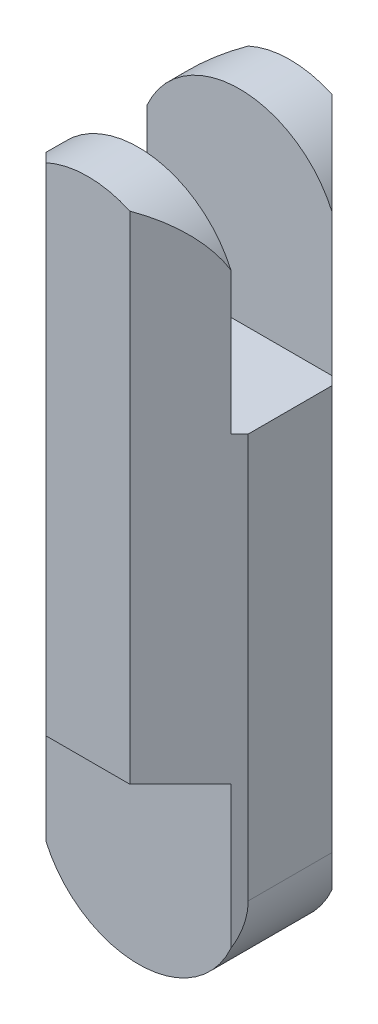
ISO-10303-21;
HEADER;
FILE_DESCRIPTION(('STEP AP214'),'2;1');
FILE_NAME('part.step','',(''),(''),'','','');
FILE_SCHEMA(('AUTOMOTIVE_DESIGN { 1 0 10303 214 1 1 1 1 }'));
ENDSEC;
DATA;
#1=APPLICATION_CONTEXT('core data for automotive mechanical design processes');
#2=APPLICATION_PROTOCOL_DEFINITION('international standard','automotive_design',2000,#1);
#3=PRODUCT_CONTEXT('',#1,'mechanical');
#4=PRODUCT('Part','Part','',(#3));
#5=PRODUCT_RELATED_PRODUCT_CATEGORY('part','',(#4));
#6=PRODUCT_DEFINITION_FORMATION('','',#4);
#7=PRODUCT_DEFINITION_CONTEXT('part definition',#1,'design');
#8=PRODUCT_DEFINITION('design','',#6,#7);
#9=PRODUCT_DEFINITION_SHAPE('','',#8);
#10=(LENGTH_UNIT() NAMED_UNIT(*) SI_UNIT(.MILLI.,.METRE.));
#11=(NAMED_UNIT(*) PLANE_ANGLE_UNIT() SI_UNIT($,.RADIAN.));
#12=(NAMED_UNIT(*) SI_UNIT($,.STERADIAN.) SOLID_ANGLE_UNIT());
#13=UNCERTAINTY_MEASURE_WITH_UNIT(LENGTH_MEASURE(1.E-05),#10,'distance_accuracy_value','');
#14=(GEOMETRIC_REPRESENTATION_CONTEXT(3) GLOBAL_UNCERTAINTY_ASSIGNED_CONTEXT((#13)) GLOBAL_UNIT_ASSIGNED_CONTEXT((#10,
#11,#12)) REPRESENTATION_CONTEXT('',''));
#15=CARTESIAN_POINT('',(0.,0.,0.));
#16=DIRECTION('',(0.,0.,1.));
#17=DIRECTION('',(1.,0.,0.));
#18=AXIS2_PLACEMENT_3D('',#15,#16,#17);
#19=CARTESIAN_POINT('',(4.14213562373094,70.,-10.));
#20=DIRECTION('',(0.,0.,1.));
#21=DIRECTION('',(1.,0.,0.));
#22=AXIS2_PLACEMENT_3D('',#19,#20,#21);
#23=PLANE('',#22);
#24=DIRECTION('',(0.,-1.,0.));
#25=VECTOR('',#24,1.);
#26=CARTESIAN_POINT('',(-4.14213562373096,70.,-10.));
#27=LINE('',#26,#25);
#28=CARTESIAN_POINT('',(-4.14213562373096,69.1017972112445,-10.));
#29=VERTEX_POINT('',#28);
#30=CARTESIAN_POINT('',(-4.14213562373096,20.,-10.));
#31=VERTEX_POINT('',#30);
#32=EDGE_CURVE('E174',#29,#31,#27,.T.);
#33=ORIENTED_EDGE('',*,*,#32,.F.);
#34=CARTESIAN_POINT('',(0.,60.,-10.));
#35=DIRECTION('',(0.,0.,1.));
#36=DIRECTION('',(1.,0.,0.));
#37=AXIS2_PLACEMENT_3D('',#34,#35,#36);
#38=CIRCLE('',#37,10.);
#39=CARTESIAN_POINT('',(4.14213562373094,69.1017972112445,-10.));
#40=VERTEX_POINT('',#39);
#41=EDGE_CURVE('E297',#29,#40,#38,.F.);
#42=ORIENTED_EDGE('',*,*,#41,.T.);
#43=DIRECTION('',(0.,-1.,0.));
#44=VECTOR('',#43,1.);
#45=CARTESIAN_POINT('',(4.14213562373094,70.,-10.));
#46=LINE('',#45,#44);
#47=CARTESIAN_POINT('',(4.14213562373094,20.,-10.));
#48=VERTEX_POINT('',#47);
#49=EDGE_CURVE('E176',#40,#48,#46,.T.);
#50=ORIENTED_EDGE('',*,*,#49,.T.);
#51=DIRECTION('',(1.,0.,0.));
#52=VECTOR('',#51,1.);
#53=CARTESIAN_POINT('',(10.,20.,-10.));
#54=LINE('',#53,#52);
#55=EDGE_CURVE('E232',#31,#48,#54,.T.);
#56=ORIENTED_EDGE('',*,*,#55,.F.);
#57=EDGE_LOOP('',(#33,#42,#50,#56));
#58=FACE_BOUND('',#57,.T.);
#59=ADVANCED_FACE('F34',(#58),#23,.F.);
#60=CARTESIAN_POINT('',(-4.14213562373096,70.,10.));
#61=DIRECTION('',(0.,0.,-1.));
#62=DIRECTION('',(-1.,0.,0.));
#63=AXIS2_PLACEMENT_3D('',#60,#61,#62);
#64=PLANE('',#63);
#65=DIRECTION('',(0.,-1.,0.));
#66=VECTOR('',#65,1.);
#67=CARTESIAN_POINT('',(4.14213562373096,70.,10.));
#68=LINE('',#67,#66);
#69=CARTESIAN_POINT('',(4.14213562373096,69.1017972112445,10.));
#70=VERTEX_POINT('',#69);
#71=CARTESIAN_POINT('',(4.14213562373096,20.,10.));
#72=VERTEX_POINT('',#71);
#73=EDGE_CURVE('E159',#70,#72,#68,.T.);
#74=ORIENTED_EDGE('',*,*,#73,.F.);
#75=CARTESIAN_POINT('',(0.,60.,10.));
#76=DIRECTION('',(0.,0.,-1.));
#77=DIRECTION('',(1.,0.,0.));
#78=AXIS2_PLACEMENT_3D('',#75,#76,#77);
#79=CIRCLE('',#78,10.);
#80=CARTESIAN_POINT('',(-4.14213562373096,69.1017972112445,10.));
#81=VERTEX_POINT('',#80);
#82=EDGE_CURVE('E147',#81,#70,#79,.T.);
#83=ORIENTED_EDGE('',*,*,#82,.F.);
#84=DIRECTION('',(0.,-1.,0.));
#85=VECTOR('',#84,1.);
#86=CARTESIAN_POINT('',(-4.14213562373096,70.,10.));
#87=LINE('',#86,#85);
#88=CARTESIAN_POINT('',(-4.14213562373096,20.,10.));
#89=VERTEX_POINT('',#88);
#90=EDGE_CURVE('E157',#81,#89,#87,.T.);
#91=ORIENTED_EDGE('',*,*,#90,.T.);
#92=DIRECTION('',(-1.,0.,0.));
#93=VECTOR('',#92,1.);
#94=CARTESIAN_POINT('',(-10.,20.,10.));
#95=LINE('',#94,#93);
#96=EDGE_CURVE('E244',#72,#89,#95,.T.);
#97=ORIENTED_EDGE('',*,*,#96,.F.);
#98=EDGE_LOOP('',(#74,#83,#91,#97));
#99=FACE_BOUND('',#98,.T.);
#100=ADVANCED_FACE('F155',(#99),#64,.F.);
#101=CARTESIAN_POINT('',(10.,70.,-4.14213562373095));
#102=DIRECTION('',(-0.707106781186547,0.,0.707106781186548));
#103=DIRECTION('',(0.707106781186548,0.,0.707106781186547));
#104=AXIS2_PLACEMENT_3D('',#101,#102,#103);
#105=PLANE('',#104);
#106=ORIENTED_EDGE('',*,*,#49,.F.);
#107=CARTESIAN_POINT('',(0.,60.,-14.1421356237309));
#108=DIRECTION('',(-0.707106781186547,0.,0.707106781186548));
#109=DIRECTION('',(0.707106781186548,0.,0.707106781186547));
#110=AXIS2_PLACEMENT_3D('',#107,#108,#109);
#111=ELLIPSE('',#110,14.1421356237309,10.);
#112=CARTESIAN_POINT('',(9.14213562373095,64.0523272618718,-5.));
#113=VERTEX_POINT('',#112);
#114=EDGE_CURVE('E293',#40,#113,#111,.F.);
#115=ORIENTED_EDGE('',*,*,#114,.T.);
#116=DIRECTION('',(0.,1.,0.));
#117=VECTOR('',#116,1.);
#118=CARTESIAN_POINT('',(9.14213562373095,70.,-5.));
#119=LINE('',#118,#117);
#120=CARTESIAN_POINT('',(9.14213562373095,50.,-5.));
#121=VERTEX_POINT('',#120);
#122=EDGE_CURVE('E221',#121,#113,#119,.T.);
#123=ORIENTED_EDGE('',*,*,#122,.F.);
#124=DIRECTION('',(0.707106781186548,0.,0.707106781186547));
#125=VECTOR('',#124,1.);
#126=CARTESIAN_POINT('',(10.,50.,-4.14213562373095));
#127=LINE('',#126,#125);
#128=CARTESIAN_POINT('',(10.,50.,-4.14213562373095));
#129=VERTEX_POINT('',#128);
#130=EDGE_CURVE('E230',#121,#129,#127,.T.);
#131=ORIENTED_EDGE('',*,*,#130,.T.);
#132=DIRECTION('',(0.,-1.,0.));
#133=VECTOR('',#132,1.);
#134=CARTESIAN_POINT('',(10.,70.,-4.14213562373095));
#135=LINE('',#134,#133);
#136=CARTESIAN_POINT('',(10.,10.,-4.14213562373095));
#137=VERTEX_POINT('',#136);
#138=EDGE_CURVE('E178',#129,#137,#135,.T.);
#139=ORIENTED_EDGE('',*,*,#138,.T.);
#140=CARTESIAN_POINT('',(0.,10.,-14.1421356237309));
#141=DIRECTION('',(-0.707106781186547,0.,0.707106781186548));
#142=DIRECTION('',(0.707106781186548,0.,0.707106781186547));
#143=AXIS2_PLACEMENT_3D('',#140,#141,#142);
#144=ELLIPSE('',#143,14.1421356237309,10.);
#145=CARTESIAN_POINT('',(9.14213562373095,5.94767273812816,-5.00000000000001));
#146=VERTEX_POINT('',#145);
#147=EDGE_CURVE('E268',#137,#146,#144,.F.);
#148=ORIENTED_EDGE('',*,*,#147,.T.);
#149=DIRECTION('',(0.,-1.,0.));
#150=VECTOR('',#149,1.);
#151=CARTESIAN_POINT('',(9.14213562373095,70.,-5.00000000000001));
#152=LINE('',#151,#150);
#153=CARTESIAN_POINT('',(9.14213562373095,20.,-5.00000000000001));
#154=VERTEX_POINT('',#153);
#155=EDGE_CURVE('E237',#154,#146,#152,.T.);
#156=ORIENTED_EDGE('',*,*,#155,.F.);
#157=DIRECTION('',(-0.707106781186548,0.,-0.707106781186547));
#158=VECTOR('',#157,1.);
#159=CARTESIAN_POINT('',(10.,20.,-4.14213562373095));
#160=LINE('',#159,#158);
#161=EDGE_CURVE('E241',#154,#48,#160,.T.);
#162=ORIENTED_EDGE('',*,*,#161,.T.);
#163=EDGE_LOOP('',(#106,#115,#123,#131,#139,#148,#156,#162));
#164=FACE_BOUND('',#163,.T.);
#165=ADVANCED_FACE('F274',(#164),#105,.F.);
#166=CARTESIAN_POINT('',(-4.14213562373096,70.,-10.));
#167=DIRECTION('',(0.707106781186548,0.,0.707106781186547));
#168=DIRECTION('',(0.707106781186547,0.,-0.707106781186548));
#169=AXIS2_PLACEMENT_3D('',#166,#167,#168);
#170=PLANE('',#169);
#171=DIRECTION('',(0.,-1.,0.));
#172=VECTOR('',#171,1.);
#173=CARTESIAN_POINT('',(-9.14213562373095,70.,-5.));
#174=LINE('',#173,#172);
#175=CARTESIAN_POINT('',(-9.14213562373095,64.0523272618718,-5.));
#176=VERTEX_POINT('',#175);
#177=CARTESIAN_POINT('',(-9.14213562373095,50.,-5.));
#178=VERTEX_POINT('',#177);
#179=EDGE_CURVE('E219',#176,#178,#174,.T.);
#180=ORIENTED_EDGE('',*,*,#179,.F.);
#181=CARTESIAN_POINT('',(0.,60.,-14.142135623731));
#182=DIRECTION('',(0.707106781186548,0.,0.707106781186547));
#183=DIRECTION('',(-0.707106781186547,0.,0.707106781186548));
#184=AXIS2_PLACEMENT_3D('',#181,#182,#183);
#185=ELLIPSE('',#184,14.142135623731,10.);
#186=EDGE_CURVE('E301',#176,#29,#185,.F.);
#187=ORIENTED_EDGE('',*,*,#186,.T.);
#188=ORIENTED_EDGE('',*,*,#32,.T.);
#189=DIRECTION('',(-0.707106781186547,0.,0.707106781186548));
#190=VECTOR('',#189,1.);
#191=CARTESIAN_POINT('',(-4.14213562373096,20.,-10.));
#192=LINE('',#191,#190);
#193=CARTESIAN_POINT('',(-9.14213562373096,20.,-5.));
#194=VERTEX_POINT('',#193);
#195=EDGE_CURVE('E187',#31,#194,#192,.T.);
#196=ORIENTED_EDGE('',*,*,#195,.T.);
#197=DIRECTION('',(0.,1.,0.));
#198=VECTOR('',#197,1.);
#199=CARTESIAN_POINT('',(-9.14213562373096,70.,-5.));
#200=LINE('',#199,#198);
#201=CARTESIAN_POINT('',(-9.14213562373096,5.94767273812821,-5.));
#202=VERTEX_POINT('',#201);
#203=EDGE_CURVE('E185',#202,#194,#200,.T.);
#204=ORIENTED_EDGE('',*,*,#203,.F.);
#205=CARTESIAN_POINT('',(0.,10.,-14.142135623731));
#206=DIRECTION('',(0.707106781186548,0.,0.707106781186547));
#207=DIRECTION('',(-0.707106781186547,0.,0.707106781186548));
#208=AXIS2_PLACEMENT_3D('',#205,#206,#207);
#209=ELLIPSE('',#208,14.142135623731,10.);
#210=CARTESIAN_POINT('',(-10.,10.,-4.14213562373095));
#211=VERTEX_POINT('',#210);
#212=EDGE_CURVE('E258',#202,#211,#209,.F.);
#213=ORIENTED_EDGE('',*,*,#212,.T.);
#214=DIRECTION('',(0.,-1.,0.));
#215=VECTOR('',#214,1.);
#216=CARTESIAN_POINT('',(-10.,70.,-4.14213562373095));
#217=LINE('',#216,#215);
#218=CARTESIAN_POINT('',(-10.,50.,-4.14213562373096));
#219=VERTEX_POINT('',#218);
#220=EDGE_CURVE('E167',#219,#211,#217,.T.);
#221=ORIENTED_EDGE('',*,*,#220,.F.);
#222=DIRECTION('',(0.707106781186547,0.,-0.707106781186548));
#223=VECTOR('',#222,1.);
#224=CARTESIAN_POINT('',(-4.14213562373096,50.,-10.));
#225=LINE('',#224,#223);
#226=EDGE_CURVE('E227',#219,#178,#225,.T.);
#227=ORIENTED_EDGE('',*,*,#226,.T.);
#228=EDGE_LOOP('',(#180,#187,#188,#196,#204,#213,#221,#227));
#229=FACE_BOUND('',#228,.T.);
#230=ADVANCED_FACE('F284',(#229),#170,.F.);
#231=CARTESIAN_POINT('',(0.,0.,-5.));
#232=DIRECTION('',(0.,0.,1.));
#233=DIRECTION('',(1.,0.,0.));
#234=AXIS2_PLACEMENT_3D('',#231,#232,#233);
#235=PLANE('',#234);
#236=CARTESIAN_POINT('',(0.,60.,-5.));
#237=DIRECTION('',(0.,0.,1.));
#238=DIRECTION('',(1.,0.,0.));
#239=AXIS2_PLACEMENT_3D('',#236,#237,#238);
#240=CIRCLE('',#239,10.);
#241=EDGE_CURVE('E151',#176,#113,#240,.F.);
#242=ORIENTED_EDGE('',*,*,#241,.F.);
#243=ORIENTED_EDGE('',*,*,#179,.T.);
#244=DIRECTION('',(1.,0.,0.));
#245=VECTOR('',#244,1.);
#246=CARTESIAN_POINT('',(-10.,50.,-5.));
#247=LINE('',#246,#245);
#248=EDGE_CURVE('E213',#178,#121,#247,.T.);
#249=ORIENTED_EDGE('',*,*,#248,.T.);
#250=ORIENTED_EDGE('',*,*,#122,.T.);
#251=EDGE_LOOP('',(#242,#243,#249,#250));
#252=FACE_BOUND('',#251,.T.);
#253=ADVANCED_FACE('F307',(#252),#235,.T.);
#254=CARTESIAN_POINT('',(0.,0.,5.));
#255=DIRECTION('',(0.,0.,1.));
#256=DIRECTION('',(1.,0.,0.));
#257=AXIS2_PLACEMENT_3D('',#254,#255,#256);
#258=PLANE('',#257);
#259=DIRECTION('',(0.,-1.,0.));
#260=VECTOR('',#259,1.);
#261=CARTESIAN_POINT('',(-9.14213562373096,70.,5.));
#262=LINE('',#261,#260);
#263=CARTESIAN_POINT('',(-9.14213562373096,64.0523272618718,5.));
#264=VERTEX_POINT('',#263);
#265=CARTESIAN_POINT('',(-9.14213562373096,50.,5.));
#266=VERTEX_POINT('',#265);
#267=EDGE_CURVE('E211',#264,#266,#262,.T.);
#268=ORIENTED_EDGE('',*,*,#267,.F.);
#269=CARTESIAN_POINT('',(0.,60.,5.));
#270=DIRECTION('',(0.,0.,1.));
#271=DIRECTION('',(1.,0.,0.));
#272=AXIS2_PLACEMENT_3D('',#269,#270,#271);
#273=CIRCLE('',#272,10.);
#274=CARTESIAN_POINT('',(9.14213562373096,64.0523272618718,5.));
#275=VERTEX_POINT('',#274);
#276=EDGE_CURVE('E11',#264,#275,#273,.F.);
#277=ORIENTED_EDGE('',*,*,#276,.T.);
#278=DIRECTION('',(0.,1.,0.));
#279=VECTOR('',#278,1.);
#280=CARTESIAN_POINT('',(9.14213562373096,70.,5.));
#281=LINE('',#280,#279);
#282=CARTESIAN_POINT('',(9.14213562373096,50.,5.));
#283=VERTEX_POINT('',#282);
#284=EDGE_CURVE('E194',#283,#275,#281,.T.);
#285=ORIENTED_EDGE('',*,*,#284,.F.);
#286=DIRECTION('',(1.,0.,0.));
#287=VECTOR('',#286,1.);
#288=CARTESIAN_POINT('',(-10.,50.,5.));
#289=LINE('',#288,#287);
#290=EDGE_CURVE('E205',#266,#283,#289,.T.);
#291=ORIENTED_EDGE('',*,*,#290,.F.);
#292=EDGE_LOOP('',(#268,#277,#285,#291));
#293=FACE_BOUND('',#292,.T.);
#294=ADVANCED_FACE('F323',(#293),#258,.F.);
#295=CARTESIAN_POINT('',(0.,10.,-56.));
#296=DIRECTION('',(0.,0.,1.));
#297=DIRECTION('',(1.,0.,0.));
#298=AXIS2_PLACEMENT_3D('',#295,#296,#297);
#299=CYLINDRICAL_SURFACE('',#298,10.);
#300=CARTESIAN_POINT('',(0.,10.,-5.));
#301=DIRECTION('',(0.,0.,-1.));
#302=DIRECTION('',(-1.,0.,0.));
#303=AXIS2_PLACEMENT_3D('',#300,#301,#302);
#304=CIRCLE('',#303,10.);
#305=EDGE_CURVE('E56',#146,#202,#304,.T.);
#306=ORIENTED_EDGE('',*,*,#305,.F.);
#307=ORIENTED_EDGE('',*,*,#147,.F.);
#308=DIRECTION('',(0.,0.,1.));
#309=VECTOR('',#308,1.);
#310=CARTESIAN_POINT('',(10.,10.,-56.));
#311=LINE('',#310,#309);
#312=CARTESIAN_POINT('',(10.,9.99999999999999,4.14213562373095));
#313=VERTEX_POINT('',#312);
#314=EDGE_CURVE('E255',#137,#313,#311,.T.);
#315=ORIENTED_EDGE('',*,*,#314,.T.);
#316=CARTESIAN_POINT('',(0.,10.,14.1421356237309));
#317=DIRECTION('',(-0.707106781186547,0.,-0.707106781186548));
#318=DIRECTION('',(-0.707106781186548,0.,0.707106781186547));
#319=AXIS2_PLACEMENT_3D('',#316,#317,#318);
#320=ELLIPSE('',#319,14.1421356237309,10.);
#321=CARTESIAN_POINT('',(9.14213562373095,5.94767273812818,5.));
#322=VERTEX_POINT('',#321);
#323=EDGE_CURVE('E263',#322,#313,#320,.F.);
#324=ORIENTED_EDGE('',*,*,#323,.F.);
#325=CARTESIAN_POINT('',(0.,10.,5.));
#326=DIRECTION('',(0.,0.,1.));
#327=DIRECTION('',(1.,0.,0.));
#328=AXIS2_PLACEMENT_3D('',#325,#326,#327);
#329=CIRCLE('',#328,10.);
#330=CARTESIAN_POINT('',(-9.14213562373095,5.94767273812819,5.));
#331=VERTEX_POINT('',#330);
#332=EDGE_CURVE('E180',#331,#322,#329,.T.);
#333=ORIENTED_EDGE('',*,*,#332,.F.);
#334=CARTESIAN_POINT('',(0.,10.,14.142135623731));
#335=DIRECTION('',(0.707106781186548,0.,-0.707106781186547));
#336=DIRECTION('',(0.707106781186547,0.,0.707106781186548));
#337=AXIS2_PLACEMENT_3D('',#334,#335,#336);
#338=ELLIPSE('',#337,14.142135623731,10.);
#339=CARTESIAN_POINT('',(-10.,10.,4.14213562373096));
#340=VERTEX_POINT('',#339);
#341=EDGE_CURVE('E265',#340,#331,#338,.F.);
#342=ORIENTED_EDGE('',*,*,#341,.F.);
#343=DIRECTION('',(0.,0.,1.));
#344=VECTOR('',#343,1.);
#345=CARTESIAN_POINT('',(-10.,10.,-56.));
#346=LINE('',#345,#344);
#347=EDGE_CURVE('E254',#211,#340,#346,.T.);
#348=ORIENTED_EDGE('',*,*,#347,.F.);
#349=ORIENTED_EDGE('',*,*,#212,.F.);
#350=EDGE_LOOP('',(#306,#307,#315,#324,#333,#342,#348,#349));
#351=FACE_BOUND('',#350,.T.);
#352=ADVANCED_FACE('F276',(#351),#299,.T.);
#353=CARTESIAN_POINT('',(-10.,70.,-4.14213562373095));
#354=DIRECTION('',(1.,0.,0.));
#355=DIRECTION('',(0.,0.,-1.));
#356=AXIS2_PLACEMENT_3D('',#353,#354,#355);
#357=PLANE('',#356);
#358=DIRECTION('',(0.,-1.,0.));
#359=VECTOR('',#358,1.);
#360=CARTESIAN_POINT('',(-10.,70.,4.14213562373096));
#361=LINE('',#360,#359);
#362=CARTESIAN_POINT('',(-10.,50.,4.14213562373096));
#363=VERTEX_POINT('',#362);
#364=EDGE_CURVE('E165',#363,#340,#361,.T.);
#365=ORIENTED_EDGE('',*,*,#364,.F.);
#366=DIRECTION('',(0.,0.,1.));
#367=VECTOR('',#366,1.);
#368=CARTESIAN_POINT('',(-10.,50.,-5.));
#369=LINE('',#368,#367);
#370=EDGE_CURVE('E209',#219,#363,#369,.T.);
#371=ORIENTED_EDGE('',*,*,#370,.F.);
#372=ORIENTED_EDGE('',*,*,#220,.T.);
#373=ORIENTED_EDGE('',*,*,#347,.T.);
#374=EDGE_LOOP('',(#365,#371,#372,#373));
#375=FACE_BOUND('',#374,.T.);
#376=ADVANCED_FACE('F321',(#375),#357,.F.);
#377=CARTESIAN_POINT('',(10.,70.,4.14213562373095));
#378=DIRECTION('',(-1.,0.,0.));
#379=DIRECTION('',(0.,0.,1.));
#380=AXIS2_PLACEMENT_3D('',#377,#378,#379);
#381=PLANE('',#380);
#382=ORIENTED_EDGE('',*,*,#138,.F.);
#383=DIRECTION('',(0.,0.,1.));
#384=VECTOR('',#383,1.);
#385=CARTESIAN_POINT('',(10.,50.,-5.));
#386=LINE('',#385,#384);
#387=CARTESIAN_POINT('',(10.,50.,4.14213562373095));
#388=VERTEX_POINT('',#387);
#389=EDGE_CURVE('E201',#129,#388,#386,.T.);
#390=ORIENTED_EDGE('',*,*,#389,.T.);
#391=DIRECTION('',(0.,-1.,0.));
#392=VECTOR('',#391,1.);
#393=CARTESIAN_POINT('',(10.,70.,4.14213562373095));
#394=LINE('',#393,#392);
#395=EDGE_CURVE('E169',#388,#313,#394,.T.);
#396=ORIENTED_EDGE('',*,*,#395,.T.);
#397=ORIENTED_EDGE('',*,*,#314,.F.);
#398=EDGE_LOOP('',(#382,#390,#396,#397));
#399=FACE_BOUND('',#398,.T.);
#400=ADVANCED_FACE('F36',(#399),#381,.F.);
#401=CARTESIAN_POINT('',(-10.,70.,4.14213562373096));
#402=DIRECTION('',(0.707106781186548,0.,-0.707106781186547));
#403=DIRECTION('',(-0.707106781186547,0.,-0.707106781186548));
#404=AXIS2_PLACEMENT_3D('',#401,#402,#403);
#405=PLANE('',#404);
#406=ORIENTED_EDGE('',*,*,#90,.F.);
#407=CARTESIAN_POINT('',(0.,60.,14.142135623731));
#408=DIRECTION('',(0.707106781186548,0.,-0.707106781186547));
#409=DIRECTION('',(0.707106781186547,0.,0.707106781186548));
#410=AXIS2_PLACEMENT_3D('',#407,#408,#409);
#411=ELLIPSE('',#410,14.142135623731,10.);
#412=EDGE_CURVE('E144',#81,#264,#411,.F.);
#413=ORIENTED_EDGE('',*,*,#412,.T.);
#414=ORIENTED_EDGE('',*,*,#267,.T.);
#415=DIRECTION('',(-0.707106781186547,0.,-0.707106781186548));
#416=VECTOR('',#415,1.);
#417=CARTESIAN_POINT('',(-10.,50.,4.14213562373096));
#418=LINE('',#417,#416);
#419=EDGE_CURVE('E224',#266,#363,#418,.T.);
#420=ORIENTED_EDGE('',*,*,#419,.T.);
#421=ORIENTED_EDGE('',*,*,#364,.T.);
#422=ORIENTED_EDGE('',*,*,#341,.T.);
#423=DIRECTION('',(0.,-1.,0.));
#424=VECTOR('',#423,1.);
#425=CARTESIAN_POINT('',(-9.14213562373095,70.,5.));
#426=LINE('',#425,#424);
#427=CARTESIAN_POINT('',(-9.14213562373095,20.,5.));
#428=VERTEX_POINT('',#427);
#429=EDGE_CURVE('E251',#428,#331,#426,.T.);
#430=ORIENTED_EDGE('',*,*,#429,.F.);
#431=DIRECTION('',(0.707106781186547,0.,0.707106781186548));
#432=VECTOR('',#431,1.);
#433=CARTESIAN_POINT('',(-10.,20.,4.14213562373096));
#434=LINE('',#433,#432);
#435=EDGE_CURVE('E164',#428,#89,#434,.T.);
#436=ORIENTED_EDGE('',*,*,#435,.T.);
#437=EDGE_LOOP('',(#406,#413,#414,#420,#421,#422,#430,#436));
#438=FACE_BOUND('',#437,.T.);
#439=ADVANCED_FACE('F162',(#438),#405,.F.);
#440=CARTESIAN_POINT('',(4.14213562373096,70.,10.));
#441=DIRECTION('',(-0.707106781186547,0.,-0.707106781186548));
#442=DIRECTION('',(-0.707106781186548,0.,0.707106781186547));
#443=AXIS2_PLACEMENT_3D('',#440,#441,#442);
#444=PLANE('',#443);
#445=ORIENTED_EDGE('',*,*,#284,.T.);
#446=CARTESIAN_POINT('',(0.,60.,14.142135623731));
#447=DIRECTION('',(-0.707106781186547,0.,-0.707106781186548));
#448=DIRECTION('',(-0.707106781186548,0.,0.707106781186547));
#449=AXIS2_PLACEMENT_3D('',#446,#447,#448);
#450=ELLIPSE('',#449,14.1421356237309,10.);
#451=EDGE_CURVE('E49',#275,#70,#450,.F.);
#452=ORIENTED_EDGE('',*,*,#451,.T.);
#453=ORIENTED_EDGE('',*,*,#73,.T.);
#454=DIRECTION('',(0.707106781186548,0.,-0.707106781186547));
#455=VECTOR('',#454,1.);
#456=CARTESIAN_POINT('',(4.14213562373096,20.,10.));
#457=LINE('',#456,#455);
#458=CARTESIAN_POINT('',(9.14213562373096,20.,5.));
#459=VERTEX_POINT('',#458);
#460=EDGE_CURVE('E182',#72,#459,#457,.T.);
#461=ORIENTED_EDGE('',*,*,#460,.T.);
#462=DIRECTION('',(0.,1.,0.));
#463=VECTOR('',#462,1.);
#464=CARTESIAN_POINT('',(9.14213562373095,70.,5.));
#465=LINE('',#464,#463);
#466=EDGE_CURVE('E248',#322,#459,#465,.T.);
#467=ORIENTED_EDGE('',*,*,#466,.F.);
#468=ORIENTED_EDGE('',*,*,#323,.T.);
#469=ORIENTED_EDGE('',*,*,#395,.F.);
#470=DIRECTION('',(-0.707106781186548,0.,0.707106781186547));
#471=VECTOR('',#470,1.);
#472=CARTESIAN_POINT('',(4.14213562373096,50.,10.));
#473=LINE('',#472,#471);
#474=EDGE_CURVE('E42',#388,#283,#473,.T.);
#475=ORIENTED_EDGE('',*,*,#474,.T.);
#476=EDGE_LOOP('',(#445,#452,#453,#461,#467,#468,#469,#475));
#477=FACE_BOUND('',#476,.T.);
#478=ADVANCED_FACE('F193',(#477),#444,.F.);
#479=CARTESIAN_POINT('',(-10.,20.,5.));
#480=DIRECTION('',(0.,1.,0.));
#481=DIRECTION('',(0.,0.,1.));
#482=AXIS2_PLACEMENT_3D('',#479,#480,#481);
#483=PLANE('',#482);
#484=DIRECTION('',(-1.,0.,0.));
#485=VECTOR('',#484,1.);
#486=CARTESIAN_POINT('',(-10.,20.,5.));
#487=LINE('',#486,#485);
#488=EDGE_CURVE('E245',#459,#428,#487,.T.);
#489=ORIENTED_EDGE('',*,*,#488,.F.);
#490=ORIENTED_EDGE('',*,*,#460,.F.);
#491=ORIENTED_EDGE('',*,*,#96,.T.);
#492=ORIENTED_EDGE('',*,*,#435,.F.);
#493=EDGE_LOOP('',(#489,#490,#491,#492));
#494=FACE_BOUND('',#493,.T.);
#495=ADVANCED_FACE('F315',(#494),#483,.F.);
#496=CARTESIAN_POINT('',(0.,10.,5.));
#497=DIRECTION('',(0.,0.,1.));
#498=DIRECTION('',(1.,0.,0.));
#499=AXIS2_PLACEMENT_3D('',#496,#497,#498);
#500=PLANE('',#499);
#501=ORIENTED_EDGE('',*,*,#429,.T.);
#502=ORIENTED_EDGE('',*,*,#332,.T.);
#503=ORIENTED_EDGE('',*,*,#466,.T.);
#504=ORIENTED_EDGE('',*,*,#488,.T.);
#505=EDGE_LOOP('',(#501,#502,#503,#504));
#506=FACE_BOUND('',#505,.T.);
#507=ADVANCED_FACE('F317',(#506),#500,.T.);
#508=CARTESIAN_POINT('',(10.,20.,-5.00000000000001));
#509=DIRECTION('',(0.,1.,0.));
#510=DIRECTION('',(0.,0.,1.));
#511=AXIS2_PLACEMENT_3D('',#508,#509,#510);
#512=PLANE('',#511);
#513=DIRECTION('',(1.,0.,0.));
#514=VECTOR('',#513,1.);
#515=CARTESIAN_POINT('',(10.,20.,-5.00000000000001));
#516=LINE('',#515,#514);
#517=EDGE_CURVE('E234',#194,#154,#516,.T.);
#518=ORIENTED_EDGE('',*,*,#517,.F.);
#519=ORIENTED_EDGE('',*,*,#195,.F.);
#520=ORIENTED_EDGE('',*,*,#55,.T.);
#521=ORIENTED_EDGE('',*,*,#161,.F.);
#522=EDGE_LOOP('',(#518,#519,#520,#521));
#523=FACE_BOUND('',#522,.T.);
#524=ADVANCED_FACE('F289',(#523),#512,.F.);
#525=CARTESIAN_POINT('',(0.,10.,-5.));
#526=DIRECTION('',(0.,0.,-1.));
#527=DIRECTION('',(-1.,0.,0.));
#528=AXIS2_PLACEMENT_3D('',#525,#526,#527);
#529=PLANE('',#528);
#530=ORIENTED_EDGE('',*,*,#155,.T.);
#531=ORIENTED_EDGE('',*,*,#305,.T.);
#532=ORIENTED_EDGE('',*,*,#203,.T.);
#533=ORIENTED_EDGE('',*,*,#517,.T.);
#534=EDGE_LOOP('',(#530,#531,#532,#533));
#535=FACE_BOUND('',#534,.T.);
#536=ADVANCED_FACE('F287',(#535),#529,.T.);
#537=CARTESIAN_POINT('',(-10.,50.,-5.));
#538=DIRECTION('',(0.,-1.,0.));
#539=DIRECTION('',(0.,0.,-1.));
#540=AXIS2_PLACEMENT_3D('',#537,#538,#539);
#541=PLANE('',#540);
#542=ORIENTED_EDGE('',*,*,#248,.F.);
#543=ORIENTED_EDGE('',*,*,#226,.F.);
#544=ORIENTED_EDGE('',*,*,#370,.T.);
#545=ORIENTED_EDGE('',*,*,#419,.F.);
#546=ORIENTED_EDGE('',*,*,#290,.T.);
#547=ORIENTED_EDGE('',*,*,#474,.F.);
#548=ORIENTED_EDGE('',*,*,#389,.F.);
#549=ORIENTED_EDGE('',*,*,#130,.F.);
#550=EDGE_LOOP('',(#542,#543,#544,#545,#546,#547,#548,#549));
#551=FACE_BOUND('',#550,.T.);
#552=ADVANCED_FACE('F200',(#551),#541,.F.);
#553=CARTESIAN_POINT('',(0.,60.,-20.));
#554=DIRECTION('',(0.,0.,1.));
#555=DIRECTION('',(1.,0.,0.));
#556=AXIS2_PLACEMENT_3D('',#553,#554,#555);
#557=CYLINDRICAL_SURFACE('',#556,10.);
#558=ORIENTED_EDGE('',*,*,#82,.T.);
#559=ORIENTED_EDGE('',*,*,#451,.F.);
#560=ORIENTED_EDGE('',*,*,#276,.F.);
#561=ORIENTED_EDGE('',*,*,#412,.F.);
#562=EDGE_LOOP('',(#558,#559,#560,#561));
#563=FACE_BOUND('',#562,.T.);
#564=ADVANCED_FACE('F146',(#563),#557,.T.);
#565=ORIENTED_EDGE('',*,*,#241,.T.);
#566=ORIENTED_EDGE('',*,*,#114,.F.);
#567=ORIENTED_EDGE('',*,*,#41,.F.);
#568=ORIENTED_EDGE('',*,*,#186,.F.);
#569=EDGE_LOOP('',(#565,#566,#567,#568));
#570=FACE_BOUND('',#569,.T.);
#571=ADVANCED_FACE('F385',(#570),#557,.T.);
#572=CLOSED_SHELL('',(#59,#100,#165,#230,#253,#294,#352,#376,#400,#439,#478,#495,#507,#524,#536,
#552,#564,#571));
#573=MANIFOLD_SOLID_BREP('B2',#572);
#574=ADVANCED_BREP_SHAPE_REPRESENTATION('',(#18,#573),#14);
#575=SHAPE_DEFINITION_REPRESENTATION(#9,#574);
ENDSEC;
END-ISO-10303-21;
